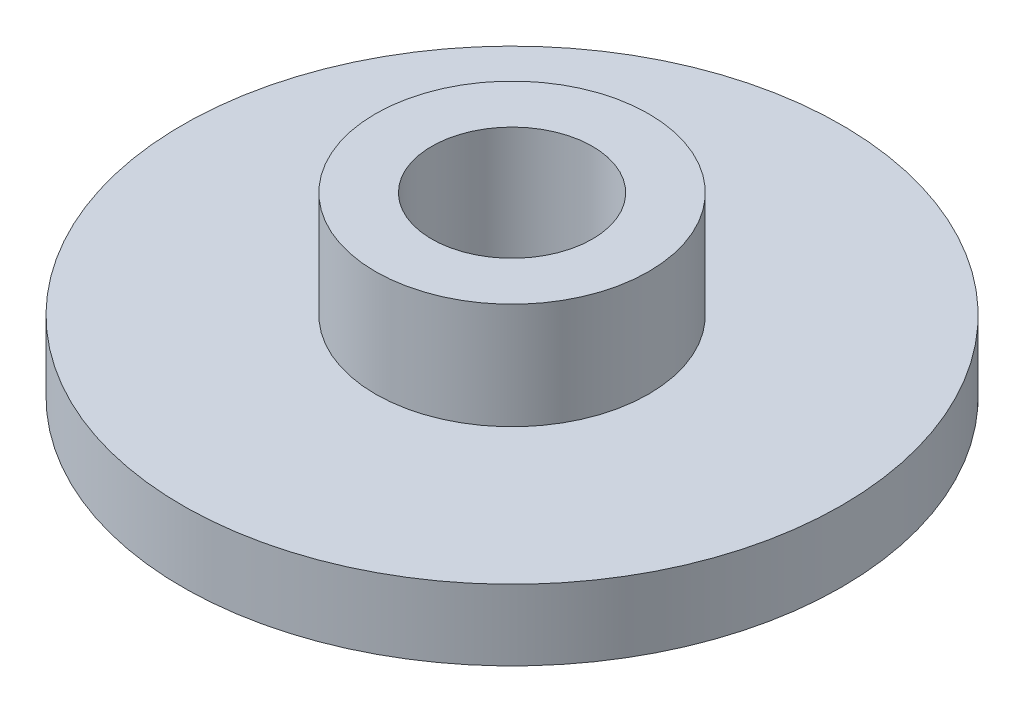
ISO-10303-21;
HEADER;
FILE_DESCRIPTION(('STEP AP214'),'2;1');
FILE_NAME('part.step','',(''),(''),'','','');
FILE_SCHEMA(('AUTOMOTIVE_DESIGN { 1 0 10303 214 1 1 1 1 }'));
ENDSEC;
DATA;
#1=APPLICATION_CONTEXT('core data for automotive mechanical design processes');
#2=APPLICATION_PROTOCOL_DEFINITION('international standard','automotive_design',2000,#1);
#3=PRODUCT_CONTEXT('',#1,'mechanical');
#4=PRODUCT('Part','Part','',(#3));
#5=PRODUCT_RELATED_PRODUCT_CATEGORY('part','',(#4));
#6=PRODUCT_DEFINITION_FORMATION('','',#4);
#7=PRODUCT_DEFINITION_CONTEXT('part definition',#1,'design');
#8=PRODUCT_DEFINITION('design','',#6,#7);
#9=PRODUCT_DEFINITION_SHAPE('','',#8);
#10=(LENGTH_UNIT() NAMED_UNIT(*) SI_UNIT(.MILLI.,.METRE.));
#11=(NAMED_UNIT(*) PLANE_ANGLE_UNIT() SI_UNIT($,.RADIAN.));
#12=(NAMED_UNIT(*) SI_UNIT($,.STERADIAN.) SOLID_ANGLE_UNIT());
#13=UNCERTAINTY_MEASURE_WITH_UNIT(LENGTH_MEASURE(1.E-05),#10,'distance_accuracy_value','');
#14=(GEOMETRIC_REPRESENTATION_CONTEXT(3) GLOBAL_UNCERTAINTY_ASSIGNED_CONTEXT((#13)) GLOBAL_UNIT_ASSIGNED_CONTEXT((#10,
#11,#12)) REPRESENTATION_CONTEXT('',''));
#15=CARTESIAN_POINT('',(0.,0.,0.));
#16=DIRECTION('',(0.,0.,1.));
#17=DIRECTION('',(1.,0.,0.));
#18=AXIS2_PLACEMENT_3D('',#15,#16,#17);
#19=CARTESIAN_POINT('',(0.,0.,0.));
#20=DIRECTION('',(0.,1.,0.));
#21=DIRECTION('',(1.,0.,0.));
#22=AXIS2_PLACEMENT_3D('',#19,#20,#21);
#23=PLANE('',#22);
#24=CARTESIAN_POINT('',(0.,0.,0.));
#25=DIRECTION('',(0.,-1.,0.));
#26=DIRECTION('',(1.,0.,0.));
#27=AXIS2_PLACEMENT_3D('',#24,#25,#26);
#28=CIRCLE('',#27,2.5);
#29=CARTESIAN_POINT('',(2.5,0.,0.));
#30=VERTEX_POINT('',#29);
#31=EDGE_CURVE('E22',#30,#30,#28,.T.);
#32=ORIENTED_EDGE('',*,*,#31,.F.);
#33=EDGE_LOOP('',(#32));
#34=FACE_BOUND('',#33,.T.);
#35=CARTESIAN_POINT('',(0.,0.,0.));
#36=DIRECTION('',(0.,1.,0.));
#37=DIRECTION('',(1.,0.,0.));
#38=AXIS2_PLACEMENT_3D('',#35,#36,#37);
#39=CIRCLE('',#38,10.25);
#40=CARTESIAN_POINT('',(10.25,0.,0.));
#41=VERTEX_POINT('',#40);
#42=EDGE_CURVE('E44',#41,#41,#39,.T.);
#43=ORIENTED_EDGE('',*,*,#42,.F.);
#44=EDGE_LOOP('',(#43));
#45=FACE_BOUND('',#44,.T.);
#46=ADVANCED_FACE('F15',(#34,#45),#23,.F.);
#47=CARTESIAN_POINT('',(0.,5.5,0.));
#48=DIRECTION('',(0.,1.,0.));
#49=DIRECTION('',(1.,0.,0.));
#50=AXIS2_PLACEMENT_3D('',#47,#48,#49);
#51=PLANE('',#50);
#52=CARTESIAN_POINT('',(0.,5.5,0.));
#53=DIRECTION('',(0.,-1.,0.));
#54=DIRECTION('',(1.,0.,0.));
#55=AXIS2_PLACEMENT_3D('',#52,#53,#54);
#56=CIRCLE('',#55,2.5);
#57=CARTESIAN_POINT('',(2.5,5.5,0.));
#58=VERTEX_POINT('',#57);
#59=EDGE_CURVE('E31',#58,#58,#56,.T.);
#60=ORIENTED_EDGE('',*,*,#59,.T.);
#61=EDGE_LOOP('',(#60));
#62=FACE_BOUND('',#61,.T.);
#63=CARTESIAN_POINT('',(0.,5.5,0.));
#64=DIRECTION('',(0.,1.,0.));
#65=DIRECTION('',(1.,0.,0.));
#66=AXIS2_PLACEMENT_3D('',#63,#64,#65);
#67=CIRCLE('',#66,4.25);
#68=CARTESIAN_POINT('',(4.25,5.5,0.));
#69=VERTEX_POINT('',#68);
#70=EDGE_CURVE('E10',#69,#69,#67,.T.);
#71=ORIENTED_EDGE('',*,*,#70,.T.);
#72=EDGE_LOOP('',(#71));
#73=FACE_BOUND('',#72,.T.);
#74=ADVANCED_FACE('F70',(#62,#73),#51,.T.);
#75=CARTESIAN_POINT('',(0.,0.,0.));
#76=DIRECTION('',(0.,1.,0.));
#77=DIRECTION('',(1.,0.,0.));
#78=AXIS2_PLACEMENT_3D('',#75,#76,#77);
#79=CYLINDRICAL_SURFACE('',#78,4.25);
#80=CARTESIAN_POINT('',(0.,2.2,0.));
#81=DIRECTION('',(0.,1.,0.));
#82=DIRECTION('',(1.,0.,0.));
#83=AXIS2_PLACEMENT_3D('',#80,#81,#82);
#84=CIRCLE('',#83,4.25);
#85=CARTESIAN_POINT('',(4.25,2.2,0.));
#86=VERTEX_POINT('',#85);
#87=EDGE_CURVE('E38',#86,#86,#84,.T.);
#88=ORIENTED_EDGE('',*,*,#87,.T.);
#89=EDGE_LOOP('',(#88));
#90=FACE_BOUND('',#89,.T.);
#91=ORIENTED_EDGE('',*,*,#70,.F.);
#92=EDGE_LOOP('',(#91));
#93=FACE_BOUND('',#92,.T.);
#94=ADVANCED_FACE('F75',(#90,#93),#79,.T.);
#95=CARTESIAN_POINT('',(0.,0.,0.));
#96=DIRECTION('',(0.,1.,0.));
#97=DIRECTION('',(1.,0.,0.));
#98=AXIS2_PLACEMENT_3D('',#95,#96,#97);
#99=CYLINDRICAL_SURFACE('',#98,2.5);
#100=ORIENTED_EDGE('',*,*,#31,.T.);
#101=EDGE_LOOP('',(#100));
#102=FACE_BOUND('',#101,.T.);
#103=ORIENTED_EDGE('',*,*,#59,.F.);
#104=EDGE_LOOP('',(#103));
#105=FACE_BOUND('',#104,.T.);
#106=ADVANCED_FACE('F65',(#102,#105),#99,.F.);
#107=CARTESIAN_POINT('',(0.,2.2,0.));
#108=DIRECTION('',(0.,1.,0.));
#109=DIRECTION('',(1.,0.,0.));
#110=AXIS2_PLACEMENT_3D('',#107,#108,#109);
#111=PLANE('',#110);
#112=ORIENTED_EDGE('',*,*,#87,.F.);
#113=EDGE_LOOP('',(#112));
#114=FACE_BOUND('',#113,.T.);
#115=CARTESIAN_POINT('',(0.,2.2,0.));
#116=DIRECTION('',(0.,1.,0.));
#117=DIRECTION('',(1.,0.,0.));
#118=AXIS2_PLACEMENT_3D('',#115,#116,#117);
#119=CIRCLE('',#118,10.25);
#120=CARTESIAN_POINT('',(10.25,2.2,0.));
#121=VERTEX_POINT('',#120);
#122=EDGE_CURVE('E48',#121,#121,#119,.T.);
#123=ORIENTED_EDGE('',*,*,#122,.T.);
#124=EDGE_LOOP('',(#123));
#125=FACE_BOUND('',#124,.T.);
#126=ADVANCED_FACE('F55',(#114,#125),#111,.T.);
#127=CARTESIAN_POINT('',(0.,0.,0.));
#128=DIRECTION('',(0.,1.,0.));
#129=DIRECTION('',(1.,0.,0.));
#130=AXIS2_PLACEMENT_3D('',#127,#128,#129);
#131=CYLINDRICAL_SURFACE('',#130,10.25);
#132=ORIENTED_EDGE('',*,*,#42,.T.);
#133=EDGE_LOOP('',(#132));
#134=FACE_BOUND('',#133,.T.);
#135=ORIENTED_EDGE('',*,*,#122,.F.);
#136=EDGE_LOOP('',(#135));
#137=FACE_BOUND('',#136,.T.);
#138=ADVANCED_FACE('F57',(#134,#137),#131,.T.);
#139=CLOSED_SHELL('',(#46,#74,#94,#106,#126,#138));
#140=MANIFOLD_SOLID_BREP('B1',#139);
#141=ADVANCED_BREP_SHAPE_REPRESENTATION('',(#18,#140),#14);
#142=SHAPE_DEFINITION_REPRESENTATION(#9,#141);
ENDSEC;
END-ISO-10303-21;
